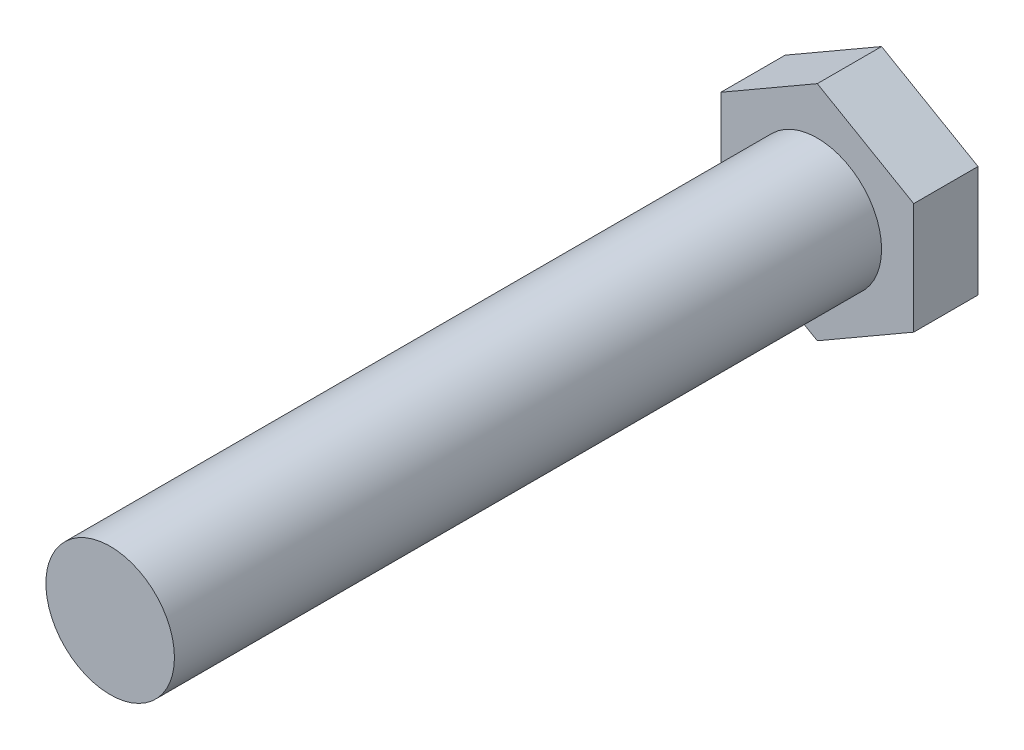
ISO-10303-21;
HEADER;
FILE_DESCRIPTION(('STEP AP214'),'2;1');
FILE_NAME('part.step','',(''),(''),'','','');
FILE_SCHEMA(('AUTOMOTIVE_DESIGN { 1 0 10303 214 1 1 1 1 }'));
ENDSEC;
DATA;
#1=APPLICATION_CONTEXT('core data for automotive mechanical design processes');
#2=APPLICATION_PROTOCOL_DEFINITION('international standard','automotive_design',2000,#1);
#3=PRODUCT_CONTEXT('',#1,'mechanical');
#4=PRODUCT('Part','Part','',(#3));
#5=PRODUCT_RELATED_PRODUCT_CATEGORY('part','',(#4));
#6=PRODUCT_DEFINITION_FORMATION('','',#4);
#7=PRODUCT_DEFINITION_CONTEXT('part definition',#1,'design');
#8=PRODUCT_DEFINITION('design','',#6,#7);
#9=PRODUCT_DEFINITION_SHAPE('','',#8);
#10=(LENGTH_UNIT() NAMED_UNIT(*) SI_UNIT(.MILLI.,.METRE.));
#11=(NAMED_UNIT(*) PLANE_ANGLE_UNIT() SI_UNIT($,.RADIAN.));
#12=(NAMED_UNIT(*) SI_UNIT($,.STERADIAN.) SOLID_ANGLE_UNIT());
#13=UNCERTAINTY_MEASURE_WITH_UNIT(LENGTH_MEASURE(1.E-05),#10,'distance_accuracy_value','');
#14=(GEOMETRIC_REPRESENTATION_CONTEXT(3) GLOBAL_UNCERTAINTY_ASSIGNED_CONTEXT((#13)) GLOBAL_UNIT_ASSIGNED_CONTEXT((#10,
#11,#12)) REPRESENTATION_CONTEXT('',''));
#15=CARTESIAN_POINT('',(0.,0.,0.));
#16=DIRECTION('',(0.,0.,1.));
#17=DIRECTION('',(1.,0.,0.));
#18=AXIS2_PLACEMENT_3D('',#15,#16,#17);
#19=CARTESIAN_POINT('',(7.5,4.3301270189222,5.));
#20=DIRECTION('',(-0.5,-0.866025403784439,0.));
#21=DIRECTION('',(0.866025403784439,-0.5,0.));
#22=AXIS2_PLACEMENT_3D('',#19,#20,#21);
#23=PLANE('',#22);
#24=DIRECTION('',(-0.866025403784439,0.5,0.));
#25=VECTOR('',#24,1.);
#26=CARTESIAN_POINT('',(7.5,4.3301270189222,0.));
#27=LINE('',#26,#25);
#28=CARTESIAN_POINT('',(7.5,4.3301270189222,0.));
#29=VERTEX_POINT('',#28);
#30=CARTESIAN_POINT('',(0.,8.66025403784439,0.));
#31=VERTEX_POINT('',#30);
#32=EDGE_CURVE('E129',#29,#31,#27,.T.);
#33=ORIENTED_EDGE('',*,*,#32,.T.);
#34=DIRECTION('',(0.,0.,-1.));
#35=VECTOR('',#34,1.);
#36=CARTESIAN_POINT('',(0.,8.66025403784439,5.));
#37=LINE('',#36,#35);
#38=CARTESIAN_POINT('',(0.,8.66025403784439,5.));
#39=VERTEX_POINT('',#38);
#40=EDGE_CURVE('E46',#39,#31,#37,.T.);
#41=ORIENTED_EDGE('',*,*,#40,.F.);
#42=DIRECTION('',(-0.866025403784439,0.5,0.));
#43=VECTOR('',#42,1.);
#44=CARTESIAN_POINT('',(7.5,4.3301270189222,5.));
#45=LINE('',#44,#43);
#46=CARTESIAN_POINT('',(7.5,4.3301270189222,5.));
#47=VERTEX_POINT('',#46);
#48=EDGE_CURVE('E140',#47,#39,#45,.T.);
#49=ORIENTED_EDGE('',*,*,#48,.F.);
#50=DIRECTION('',(0.,0.,-1.));
#51=VECTOR('',#50,1.);
#52=CARTESIAN_POINT('',(7.5,4.3301270189222,5.));
#53=LINE('',#52,#51);
#54=EDGE_CURVE('E125',#47,#29,#53,.T.);
#55=ORIENTED_EDGE('',*,*,#54,.T.);
#56=EDGE_LOOP('',(#33,#41,#49,#55));
#57=FACE_BOUND('',#56,.T.);
#58=ADVANCED_FACE('F43',(#57),#23,.F.);
#59=CARTESIAN_POINT('',(0.,8.66025403784439,5.));
#60=DIRECTION('',(0.5,-0.866025403784439,0.));
#61=DIRECTION('',(0.866025403784439,0.5,0.));
#62=AXIS2_PLACEMENT_3D('',#59,#60,#61);
#63=PLANE('',#62);
#64=DIRECTION('',(-0.866025403784439,-0.5,0.));
#65=VECTOR('',#64,1.);
#66=CARTESIAN_POINT('',(0.,8.66025403784439,0.));
#67=LINE('',#66,#65);
#68=CARTESIAN_POINT('',(-7.5,4.3301270189222,0.));
#69=VERTEX_POINT('',#68);
#70=EDGE_CURVE('E132',#31,#69,#67,.T.);
#71=ORIENTED_EDGE('',*,*,#70,.T.);
#72=DIRECTION('',(0.,0.,-1.));
#73=VECTOR('',#72,1.);
#74=CARTESIAN_POINT('',(-7.5,4.3301270189222,5.));
#75=LINE('',#74,#73);
#76=CARTESIAN_POINT('',(-7.5,4.3301270189222,5.));
#77=VERTEX_POINT('',#76);
#78=EDGE_CURVE('E143',#77,#69,#75,.T.);
#79=ORIENTED_EDGE('',*,*,#78,.F.);
#80=DIRECTION('',(-0.866025403784439,-0.5,0.));
#81=VECTOR('',#80,1.);
#82=CARTESIAN_POINT('',(0.,8.66025403784439,5.));
#83=LINE('',#82,#81);
#84=EDGE_CURVE('E98',#39,#77,#83,.T.);
#85=ORIENTED_EDGE('',*,*,#84,.F.);
#86=ORIENTED_EDGE('',*,*,#40,.T.);
#87=EDGE_LOOP('',(#71,#79,#85,#86));
#88=FACE_BOUND('',#87,.T.);
#89=ADVANCED_FACE('F148',(#88),#63,.F.);
#90=CARTESIAN_POINT('',(-7.5,4.3301270189222,5.));
#91=DIRECTION('',(1.,0.,0.));
#92=DIRECTION('',(0.,1.,0.));
#93=AXIS2_PLACEMENT_3D('',#90,#91,#92);
#94=PLANE('',#93);
#95=DIRECTION('',(0.,-1.,0.));
#96=VECTOR('',#95,1.);
#97=CARTESIAN_POINT('',(-7.5,4.3301270189222,0.));
#98=LINE('',#97,#96);
#99=CARTESIAN_POINT('',(-7.5,-4.33012701892219,0.));
#100=VERTEX_POINT('',#99);
#101=EDGE_CURVE('E135',#69,#100,#98,.T.);
#102=ORIENTED_EDGE('',*,*,#101,.T.);
#103=DIRECTION('',(0.,0.,-1.));
#104=VECTOR('',#103,1.);
#105=CARTESIAN_POINT('',(-7.5,-4.33012701892219,5.));
#106=LINE('',#105,#104);
#107=CARTESIAN_POINT('',(-7.5,-4.33012701892219,5.));
#108=VERTEX_POINT('',#107);
#109=EDGE_CURVE('E120',#108,#100,#106,.T.);
#110=ORIENTED_EDGE('',*,*,#109,.F.);
#111=DIRECTION('',(0.,-1.,0.));
#112=VECTOR('',#111,1.);
#113=CARTESIAN_POINT('',(-7.5,4.3301270189222,5.));
#114=LINE('',#113,#112);
#115=EDGE_CURVE('E111',#77,#108,#114,.T.);
#116=ORIENTED_EDGE('',*,*,#115,.F.);
#117=ORIENTED_EDGE('',*,*,#78,.T.);
#118=EDGE_LOOP('',(#102,#110,#116,#117));
#119=FACE_BOUND('',#118,.T.);
#120=ADVANCED_FACE('F154',(#119),#94,.F.);
#121=CARTESIAN_POINT('',(-7.5,-4.33012701892219,5.));
#122=DIRECTION('',(0.5,0.866025403784438,0.));
#123=DIRECTION('',(-0.866025403784438,0.5,0.));
#124=AXIS2_PLACEMENT_3D('',#121,#122,#123);
#125=PLANE('',#124);
#126=DIRECTION('',(0.866025403784439,-0.5,0.));
#127=VECTOR('',#126,1.);
#128=CARTESIAN_POINT('',(-7.5,-4.33012701892219,0.));
#129=LINE('',#128,#127);
#130=CARTESIAN_POINT('',(0.,-8.66025403784439,0.));
#131=VERTEX_POINT('',#130);
#132=EDGE_CURVE('E119',#100,#131,#129,.T.);
#133=ORIENTED_EDGE('',*,*,#132,.T.);
#134=DIRECTION('',(0.,0.,-1.));
#135=VECTOR('',#134,1.);
#136=CARTESIAN_POINT('',(0.,-8.66025403784439,5.));
#137=LINE('',#136,#135);
#138=CARTESIAN_POINT('',(0.,-8.66025403784439,5.));
#139=VERTEX_POINT('',#138);
#140=EDGE_CURVE('E116',#139,#131,#137,.T.);
#141=ORIENTED_EDGE('',*,*,#140,.F.);
#142=DIRECTION('',(0.866025403784439,-0.5,0.));
#143=VECTOR('',#142,1.);
#144=CARTESIAN_POINT('',(-7.5,-4.33012701892219,5.));
#145=LINE('',#144,#143);
#146=EDGE_CURVE('E105',#108,#139,#145,.T.);
#147=ORIENTED_EDGE('',*,*,#146,.F.);
#148=ORIENTED_EDGE('',*,*,#109,.T.);
#149=EDGE_LOOP('',(#133,#141,#147,#148));
#150=FACE_BOUND('',#149,.T.);
#151=ADVANCED_FACE('F117',(#150),#125,.F.);
#152=CARTESIAN_POINT('',(0.,-8.66025403784439,5.));
#153=DIRECTION('',(-0.5,0.866025403784439,0.));
#154=DIRECTION('',(-0.866025403784439,-0.5,0.));
#155=AXIS2_PLACEMENT_3D('',#152,#153,#154);
#156=PLANE('',#155);
#157=DIRECTION('',(0.866025403784439,0.5,0.));
#158=VECTOR('',#157,1.);
#159=CARTESIAN_POINT('',(0.,-8.66025403784439,0.));
#160=LINE('',#159,#158);
#161=CARTESIAN_POINT('',(7.5,-4.3301270189222,0.));
#162=VERTEX_POINT('',#161);
#163=EDGE_CURVE('E83',#131,#162,#160,.T.);
#164=ORIENTED_EDGE('',*,*,#163,.T.);
#165=DIRECTION('',(0.,0.,-1.));
#166=VECTOR('',#165,1.);
#167=CARTESIAN_POINT('',(7.5,-4.3301270189222,5.));
#168=LINE('',#167,#166);
#169=CARTESIAN_POINT('',(7.5,-4.3301270189222,5.));
#170=VERTEX_POINT('',#169);
#171=EDGE_CURVE('E121',#170,#162,#168,.T.);
#172=ORIENTED_EDGE('',*,*,#171,.F.);
#173=DIRECTION('',(0.866025403784439,0.5,0.));
#174=VECTOR('',#173,1.);
#175=CARTESIAN_POINT('',(0.,-8.66025403784439,5.));
#176=LINE('',#175,#174);
#177=EDGE_CURVE('E109',#139,#170,#176,.T.);
#178=ORIENTED_EDGE('',*,*,#177,.F.);
#179=ORIENTED_EDGE('',*,*,#140,.T.);
#180=EDGE_LOOP('',(#164,#172,#178,#179));
#181=FACE_BOUND('',#180,.T.);
#182=ADVANCED_FACE('F123',(#181),#156,.F.);
#183=CARTESIAN_POINT('',(7.5,-4.3301270189222,5.));
#184=DIRECTION('',(-1.,0.,0.));
#185=DIRECTION('',(0.,-1.,0.));
#186=AXIS2_PLACEMENT_3D('',#183,#184,#185);
#187=PLANE('',#186);
#188=DIRECTION('',(0.,1.,0.));
#189=VECTOR('',#188,1.);
#190=CARTESIAN_POINT('',(7.5,-4.3301270189222,0.));
#191=LINE('',#190,#189);
#192=EDGE_CURVE('E89',#162,#29,#191,.T.);
#193=ORIENTED_EDGE('',*,*,#192,.T.);
#194=ORIENTED_EDGE('',*,*,#54,.F.);
#195=DIRECTION('',(0.,1.,0.));
#196=VECTOR('',#195,1.);
#197=CARTESIAN_POINT('',(7.5,-4.3301270189222,5.));
#198=LINE('',#197,#196);
#199=EDGE_CURVE('E60',#170,#47,#198,.T.);
#200=ORIENTED_EDGE('',*,*,#199,.F.);
#201=ORIENTED_EDGE('',*,*,#171,.T.);
#202=EDGE_LOOP('',(#193,#194,#200,#201));
#203=FACE_BOUND('',#202,.T.);
#204=ADVANCED_FACE('F170',(#203),#187,.F.);
#205=CARTESIAN_POINT('',(0.,0.,5.));
#206=DIRECTION('',(0.,0.,1.));
#207=DIRECTION('',(1.,0.,0.));
#208=AXIS2_PLACEMENT_3D('',#205,#206,#207);
#209=PLANE('',#208);
#210=CARTESIAN_POINT('',(0.,0.,5.));
#211=DIRECTION('',(0.,0.,1.));
#212=DIRECTION('',(1.,0.,0.));
#213=AXIS2_PLACEMENT_3D('',#210,#211,#212);
#214=CIRCLE('',#213,5.);
#215=CARTESIAN_POINT('',(5.,0.,5.));
#216=VERTEX_POINT('',#215);
#217=EDGE_CURVE('E11',#216,#216,#214,.T.);
#218=ORIENTED_EDGE('',*,*,#217,.F.);
#219=EDGE_LOOP('',(#218));
#220=FACE_BOUND('',#219,.T.);
#221=ORIENTED_EDGE('',*,*,#48,.T.);
#222=ORIENTED_EDGE('',*,*,#84,.T.);
#223=ORIENTED_EDGE('',*,*,#115,.T.);
#224=ORIENTED_EDGE('',*,*,#146,.T.);
#225=ORIENTED_EDGE('',*,*,#177,.T.);
#226=ORIENTED_EDGE('',*,*,#199,.T.);
#227=EDGE_LOOP('',(#221,#222,#223,#224,#225,#226));
#228=FACE_BOUND('',#227,.T.);
#229=ADVANCED_FACE('F107',(#220,#228),#209,.T.);
#230=CARTESIAN_POINT('',(0.,0.,0.));
#231=DIRECTION('',(0.,0.,1.));
#232=DIRECTION('',(1.,0.,0.));
#233=AXIS2_PLACEMENT_3D('',#230,#231,#232);
#234=PLANE('',#233);
#235=ORIENTED_EDGE('',*,*,#32,.F.);
#236=ORIENTED_EDGE('',*,*,#192,.F.);
#237=ORIENTED_EDGE('',*,*,#163,.F.);
#238=ORIENTED_EDGE('',*,*,#132,.F.);
#239=ORIENTED_EDGE('',*,*,#101,.F.);
#240=ORIENTED_EDGE('',*,*,#70,.F.);
#241=EDGE_LOOP('',(#235,#236,#237,#238,#239,#240));
#242=FACE_BOUND('',#241,.T.);
#243=ADVANCED_FACE('F153',(#242),#234,.F.);
#244=CARTESIAN_POINT('',(0.,0.,60.));
#245=DIRECTION('',(0.,0.,-1.));
#246=DIRECTION('',(-1.,0.,0.));
#247=AXIS2_PLACEMENT_3D('',#244,#245,#246);
#248=CYLINDRICAL_SURFACE('',#247,5.);
#249=CARTESIAN_POINT('',(0.,0.,60.));
#250=DIRECTION('',(0.,0.,1.));
#251=DIRECTION('',(1.,0.,0.));
#252=AXIS2_PLACEMENT_3D('',#249,#250,#251);
#253=CIRCLE('',#252,5.);
#254=CARTESIAN_POINT('',(5.,0.,60.));
#255=VERTEX_POINT('',#254);
#256=EDGE_CURVE('E133',#255,#255,#253,.T.);
#257=ORIENTED_EDGE('',*,*,#256,.F.);
#258=EDGE_LOOP('',(#257));
#259=FACE_BOUND('',#258,.T.);
#260=ORIENTED_EDGE('',*,*,#217,.T.);
#261=EDGE_LOOP('',(#260));
#262=FACE_BOUND('',#261,.T.);
#263=ADVANCED_FACE('F163',(#259,#262),#248,.T.);
#264=CARTESIAN_POINT('',(0.,0.,60.));
#265=DIRECTION('',(0.,0.,1.));
#266=DIRECTION('',(1.,0.,0.));
#267=AXIS2_PLACEMENT_3D('',#264,#265,#266);
#268=PLANE('',#267);
#269=ORIENTED_EDGE('',*,*,#256,.T.);
#270=EDGE_LOOP('',(#269));
#271=FACE_BOUND('',#270,.T.);
#272=ADVANCED_FACE('F161',(#271),#268,.T.);
#273=CLOSED_SHELL('',(#58,#89,#120,#151,#182,#204,#229,#243,#263,#272));
#274=MANIFOLD_SOLID_BREP('B2',#273);
#275=ADVANCED_BREP_SHAPE_REPRESENTATION('',(#18,#274),#14);
#276=SHAPE_DEFINITION_REPRESENTATION(#9,#275);
ENDSEC;
END-ISO-10303-21;
